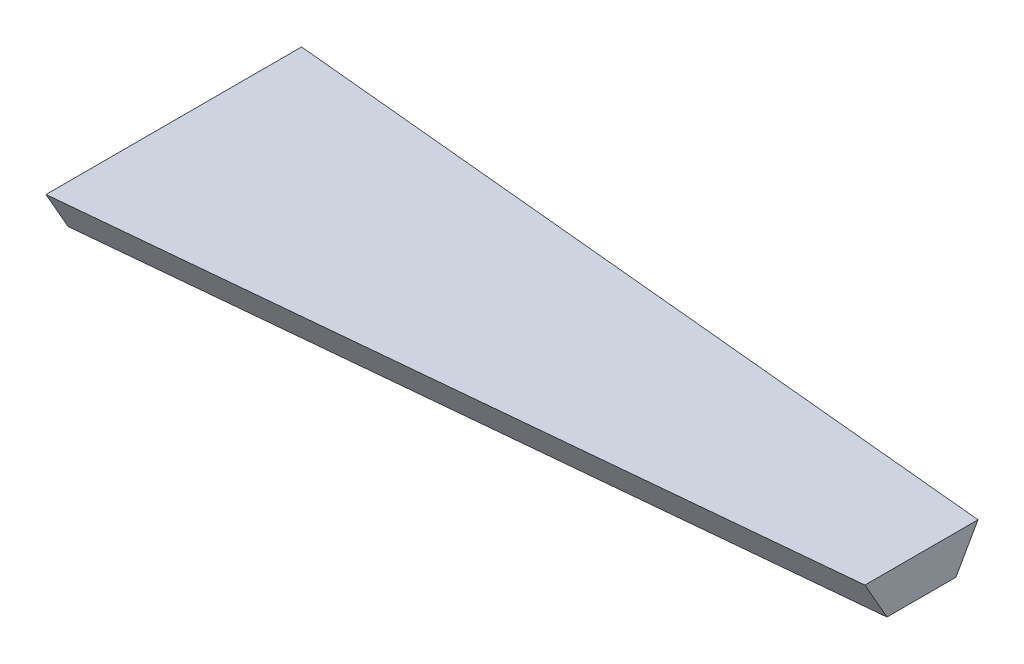
ISO-10303-21;
HEADER;
FILE_DESCRIPTION(('STEP AP214'),'2;1');
FILE_NAME('part.step','',(''),(''),'','','');
FILE_SCHEMA(('AUTOMOTIVE_DESIGN { 1 0 10303 214 1 1 1 1 }'));
ENDSEC;
DATA;
#1=APPLICATION_CONTEXT('core data for automotive mechanical design processes');
#2=APPLICATION_PROTOCOL_DEFINITION('international standard','automotive_design',2000,#1);
#3=PRODUCT_CONTEXT('',#1,'mechanical');
#4=PRODUCT('Part','Part','',(#3));
#5=PRODUCT_RELATED_PRODUCT_CATEGORY('part','',(#4));
#6=PRODUCT_DEFINITION_FORMATION('','',#4);
#7=PRODUCT_DEFINITION_CONTEXT('part definition',#1,'design');
#8=PRODUCT_DEFINITION('design','',#6,#7);
#9=PRODUCT_DEFINITION_SHAPE('','',#8);
#10=(LENGTH_UNIT() NAMED_UNIT(*) SI_UNIT(.MILLI.,.METRE.));
#11=(NAMED_UNIT(*) PLANE_ANGLE_UNIT() SI_UNIT($,.RADIAN.));
#12=(NAMED_UNIT(*) SI_UNIT($,.STERADIAN.) SOLID_ANGLE_UNIT());
#13=UNCERTAINTY_MEASURE_WITH_UNIT(LENGTH_MEASURE(1.E-05),#10,'distance_accuracy_value','');
#14=(GEOMETRIC_REPRESENTATION_CONTEXT(3) GLOBAL_UNCERTAINTY_ASSIGNED_CONTEXT((#13)) GLOBAL_UNIT_ASSIGNED_CONTEXT((#10,
#11,#12)) REPRESENTATION_CONTEXT('',''));
#15=CARTESIAN_POINT('',(0.,0.,0.));
#16=DIRECTION('',(0.,0.,1.));
#17=DIRECTION('',(1.,0.,0.));
#18=AXIS2_PLACEMENT_3D('',#15,#16,#17);
#19=CARTESIAN_POINT('',(367.245577586154,0.,34.9949337967697));
#20=DIRECTION('',(0.0825238029303359,-0.493142800768617,-0.866025403784438));
#21=DIRECTION('',(0.,0.868989445240945,-0.494830621586653));
#22=AXIS2_PLACEMENT_3D('',#19,#20,#21);
#23=PLANE('',#22);
#24=DIRECTION('',(0.,0.868989445240945,-0.494830621586653));
#25=VECTOR('',#24,1.);
#26=CARTESIAN_POINT('',(0.,-15.0479120764316,8.56876654502674));
#27=LINE('',#26,#25);
#28=CARTESIAN_POINT('',(0.,19.05,-10.8476845062394));
#29=VERTEX_POINT('',#28);
#30=CARTESIAN_POINT('',(0.,0.,0.));
#31=VERTEX_POINT('',#30);
#32=EDGE_CURVE('E59',#29,#31,#27,.F.);
#33=ORIENTED_EDGE('',*,*,#32,.F.);
#34=DIRECTION('',(0.995490568200445,0.,0.0948605746554172));
#35=VECTOR('',#34,1.);
#36=CARTESIAN_POINT('',(368.269954887472,19.05,24.2448624900633));
#37=LINE('',#36,#35);
#38=CARTESIAN_POINT('',(367.245577586154,19.05,24.1472492905303));
#39=VERTEX_POINT('',#38);
#40=EDGE_CURVE('E44',#39,#29,#37,.F.);
#41=ORIENTED_EDGE('',*,*,#40,.F.);
#42=DIRECTION('',(0.,-0.868989445240945,0.494830621586653));
#43=VECTOR('',#42,1.);
#44=CARTESIAN_POINT('',(367.245577586154,0.,34.9949337967697));
#45=LINE('',#44,#43);
#46=CARTESIAN_POINT('',(367.245577586154,0.,34.9949337967697));
#47=VERTEX_POINT('',#46);
#48=EDGE_CURVE('E78',#47,#39,#45,.F.);
#49=ORIENTED_EDGE('',*,*,#48,.F.);
#50=DIRECTION('',(-0.995490568200444,0.,-0.0948605746554172));
#51=VECTOR('',#50,1.);
#52=CARTESIAN_POINT('',(367.245577586154,0.,34.9949337967697));
#53=LINE('',#52,#51);
#54=EDGE_CURVE('E88',#47,#31,#53,.T.);
#55=ORIENTED_EDGE('',*,*,#54,.T.);
#56=EDGE_LOOP('',(#33,#41,#49,#55));
#57=FACE_BOUND('',#56,.T.);
#58=ADVANCED_FACE('F36',(#57),#23,.T.);
#59=CARTESIAN_POINT('',(0.,0.,103.835367593539));
#60=DIRECTION('',(0.082523802930336,-0.493142800768617,0.866025403784438));
#61=DIRECTION('',(0.,-0.868989445240945,-0.494830621586653));
#62=AXIS2_PLACEMENT_3D('',#59,#60,#61);
#63=PLANE('',#62);
#64=DIRECTION('',(0.,-0.868989445240945,-0.494830621586653));
#65=VECTOR('',#64,1.);
#66=CARTESIAN_POINT('',(0.,0.,103.835367593539));
#67=LINE('',#66,#65);
#68=CARTESIAN_POINT('',(0.,0.,103.835367593539));
#69=VERTEX_POINT('',#68);
#70=CARTESIAN_POINT('',(0.,19.05,114.683052099779));
#71=VERTEX_POINT('',#70);
#72=EDGE_CURVE('E96',#69,#71,#67,.F.);
#73=ORIENTED_EDGE('',*,*,#72,.F.);
#74=DIRECTION('',(0.995490568200444,0.,-0.0948605746554174));
#75=VECTOR('',#74,1.);
#76=CARTESIAN_POINT('',(0.,0.,103.835367593539));
#77=LINE('',#76,#75);
#78=CARTESIAN_POINT('',(367.245577586154,0.,68.8404337967697));
#79=VERTEX_POINT('',#78);
#80=EDGE_CURVE('E83',#69,#79,#77,.T.);
#81=ORIENTED_EDGE('',*,*,#80,.T.);
#82=DIRECTION('',(0.,0.868989445240945,0.494830621586653));
#83=VECTOR('',#82,1.);
#84=CARTESIAN_POINT('',(367.245577586154,15.0479120764316,77.4092003417964));
#85=LINE('',#84,#83);
#86=CARTESIAN_POINT('',(367.245577586154,19.05,79.688118303009));
#87=VERTEX_POINT('',#86);
#88=EDGE_CURVE('E51',#87,#79,#85,.F.);
#89=ORIENTED_EDGE('',*,*,#88,.F.);
#90=DIRECTION('',(-0.995490568200445,0.,0.0948605746554174));
#91=VECTOR('',#90,1.);
#92=CARTESIAN_POINT('',(1.0243773013182,19.05,114.585438900246));
#93=LINE('',#92,#91);
#94=EDGE_CURVE('E12',#71,#87,#93,.F.);
#95=ORIENTED_EDGE('',*,*,#94,.F.);
#96=EDGE_LOOP('',(#73,#81,#89,#95));
#97=FACE_BOUND('',#96,.T.);
#98=ADVANCED_FACE('F38',(#97),#63,.T.);
#99=CARTESIAN_POINT('',(0.,19.05,0.));
#100=DIRECTION('',(0.,1.,0.));
#101=DIRECTION('',(0.,0.,1.));
#102=AXIS2_PLACEMENT_3D('',#99,#100,#101);
#103=PLANE('',#102);
#104=ORIENTED_EDGE('',*,*,#40,.T.);
#105=DIRECTION('',(0.,0.,1.));
#106=VECTOR('',#105,1.);
#107=CARTESIAN_POINT('',(0.,19.05,0.));
#108=LINE('',#107,#106);
#109=EDGE_CURVE('E90',#29,#71,#108,.T.);
#110=ORIENTED_EDGE('',*,*,#109,.T.);
#111=ORIENTED_EDGE('',*,*,#94,.T.);
#112=DIRECTION('',(0.,0.,-1.));
#113=VECTOR('',#112,1.);
#114=CARTESIAN_POINT('',(367.245577586154,19.05,0.));
#115=LINE('',#114,#113);
#116=EDGE_CURVE('E104',#87,#39,#115,.T.);
#117=ORIENTED_EDGE('',*,*,#116,.T.);
#118=EDGE_LOOP('',(#104,#110,#111,#117));
#119=FACE_BOUND('',#118,.T.);
#120=ADVANCED_FACE('F102',(#119),#103,.T.);
#121=CARTESIAN_POINT('',(0.,0.,0.));
#122=DIRECTION('',(0.,1.,0.));
#123=DIRECTION('',(0.,0.,1.));
#124=AXIS2_PLACEMENT_3D('',#121,#122,#123);
#125=PLANE('',#124);
#126=ORIENTED_EDGE('',*,*,#54,.F.);
#127=DIRECTION('',(0.,0.,-1.));
#128=VECTOR('',#127,1.);
#129=CARTESIAN_POINT('',(367.245577586154,0.,68.8404337967697));
#130=LINE('',#129,#128);
#131=EDGE_CURVE('E75',#79,#47,#130,.T.);
#132=ORIENTED_EDGE('',*,*,#131,.F.);
#133=ORIENTED_EDGE('',*,*,#80,.F.);
#134=DIRECTION('',(0.,0.,1.));
#135=VECTOR('',#134,1.);
#136=CARTESIAN_POINT('',(0.,0.,0.));
#137=LINE('',#136,#135);
#138=EDGE_CURVE('E93',#31,#69,#137,.T.);
#139=ORIENTED_EDGE('',*,*,#138,.F.);
#140=EDGE_LOOP('',(#126,#132,#133,#139));
#141=FACE_BOUND('',#140,.T.);
#142=ADVANCED_FACE('F92',(#141),#125,.F.);
#143=CARTESIAN_POINT('',(367.245577586154,0.,-11.8767020921819));
#144=DIRECTION('',(1.,0.,0.));
#145=DIRECTION('',(0.,0.,-1.));
#146=AXIS2_PLACEMENT_3D('',#143,#144,#145);
#147=PLANE('',#146);
#148=ORIENTED_EDGE('',*,*,#48,.T.);
#149=ORIENTED_EDGE('',*,*,#116,.F.);
#150=ORIENTED_EDGE('',*,*,#88,.T.);
#151=ORIENTED_EDGE('',*,*,#131,.T.);
#152=EDGE_LOOP('',(#148,#149,#150,#151));
#153=FACE_BOUND('',#152,.T.);
#154=ADVANCED_FACE('F77',(#153),#147,.T.);
#155=CARTESIAN_POINT('',(0.,0.,-11.8767020921819));
#156=DIRECTION('',(-1.,0.,0.));
#157=DIRECTION('',(0.,0.,1.));
#158=AXIS2_PLACEMENT_3D('',#155,#156,#157);
#159=PLANE('',#158);
#160=ORIENTED_EDGE('',*,*,#32,.T.);
#161=ORIENTED_EDGE('',*,*,#138,.T.);
#162=ORIENTED_EDGE('',*,*,#72,.T.);
#163=ORIENTED_EDGE('',*,*,#109,.F.);
#164=EDGE_LOOP('',(#160,#161,#162,#163));
#165=FACE_BOUND('',#164,.T.);
#166=ADVANCED_FACE('F109',(#165),#159,.T.);
#167=CLOSED_SHELL('',(#58,#98,#120,#142,#154,#166));
#168=MANIFOLD_SOLID_BREP('B2',#167);
#169=ADVANCED_BREP_SHAPE_REPRESENTATION('',(#18,#168),#14);
#170=SHAPE_DEFINITION_REPRESENTATION(#9,#169);
ENDSEC;
END-ISO-10303-21;
